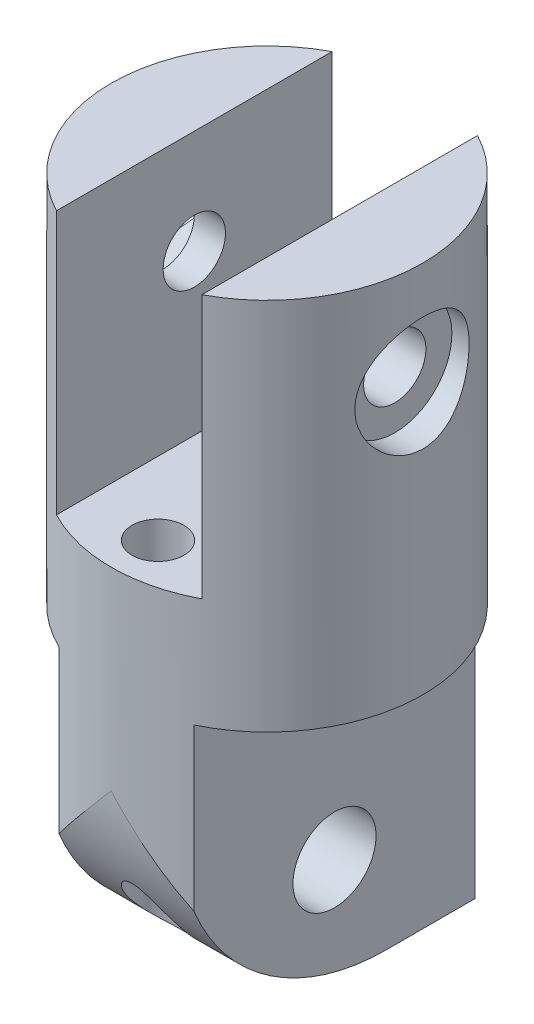
ISO-10303-21;
HEADER;
FILE_DESCRIPTION(('STEP AP214'),'2;1');
FILE_NAME('part.step','',(''),(''),'','','');
FILE_SCHEMA(('AUTOMOTIVE_DESIGN { 1 0 10303 214 1 1 1 1 }'));
ENDSEC;
DATA;
#1=APPLICATION_CONTEXT('core data for automotive mechanical design processes');
#2=APPLICATION_PROTOCOL_DEFINITION('international standard','automotive_design',2000,#1);
#3=PRODUCT_CONTEXT('',#1,'mechanical');
#4=PRODUCT('Part','Part','',(#3));
#5=PRODUCT_RELATED_PRODUCT_CATEGORY('part','',(#4));
#6=PRODUCT_DEFINITION_FORMATION('','',#4);
#7=PRODUCT_DEFINITION_CONTEXT('part definition',#1,'design');
#8=PRODUCT_DEFINITION('design','',#6,#7);
#9=PRODUCT_DEFINITION_SHAPE('','',#8);
#10=(LENGTH_UNIT() NAMED_UNIT(*) SI_UNIT(.MILLI.,.METRE.));
#11=(NAMED_UNIT(*) PLANE_ANGLE_UNIT() SI_UNIT($,.RADIAN.));
#12=(NAMED_UNIT(*) SI_UNIT($,.STERADIAN.) SOLID_ANGLE_UNIT());
#13=UNCERTAINTY_MEASURE_WITH_UNIT(LENGTH_MEASURE(1.E-05),#10,'distance_accuracy_value','');
#14=(GEOMETRIC_REPRESENTATION_CONTEXT(3) GLOBAL_UNCERTAINTY_ASSIGNED_CONTEXT((#13)) GLOBAL_UNIT_ASSIGNED_CONTEXT((#10,
#11,#12)) REPRESENTATION_CONTEXT('',''));
#15=CARTESIAN_POINT('',(0.,0.,0.));
#16=DIRECTION('',(0.,0.,1.));
#17=DIRECTION('',(1.,0.,0.));
#18=AXIS2_PLACEMENT_3D('',#15,#16,#17);
#19=CARTESIAN_POINT('',(3.25,7.,15.));
#20=DIRECTION('',(-1.,0.,0.));
#21=DIRECTION('',(0.,-1.,0.));
#22=AXIS2_PLACEMENT_3D('',#19,#20,#21);
#23=PLANE('',#22);
#24=CARTESIAN_POINT('',(3.25,-2.,7.5));
#25=DIRECTION('',(1.,0.,0.));
#26=DIRECTION('',(0.,1.,0.));
#27=AXIS2_PLACEMENT_3D('',#24,#25,#26);
#28=CIRCLE('',#27,2.);
#29=CARTESIAN_POINT('',(3.25,0.,7.5));
#30=VERTEX_POINT('',#29);
#31=EDGE_CURVE('E362',#30,#30,#28,.T.);
#32=ORIENTED_EDGE('',*,*,#31,.F.);
#33=EDGE_LOOP('',(#32));
#34=FACE_BOUND('',#33,.T.);
#35=DIRECTION('',(0.,1.,0.));
#36=VECTOR('',#35,1.);
#37=CARTESIAN_POINT('',(3.25,-7.,0.740747082702113));
#38=LINE('',#37,#36);
#39=CARTESIAN_POINT('',(3.25,-7.,0.740747082702113));
#40=VERTEX_POINT('',#39);
#41=CARTESIAN_POINT('',(3.25,7.,0.740747082702113));
#42=VERTEX_POINT('',#41);
#43=EDGE_CURVE('E241',#40,#42,#38,.T.);
#44=ORIENTED_EDGE('',*,*,#43,.T.);
#45=DIRECTION('',(0.,0.,-1.));
#46=VECTOR('',#45,1.);
#47=CARTESIAN_POINT('',(3.25,7.,15.));
#48=LINE('',#47,#46);
#49=CARTESIAN_POINT('',(3.25,7.,14.2592529172979));
#50=VERTEX_POINT('',#49);
#51=EDGE_CURVE('E380',#50,#42,#48,.T.);
#52=ORIENTED_EDGE('',*,*,#51,.F.);
#53=DIRECTION('',(0.,1.,0.));
#54=VECTOR('',#53,1.);
#55=CARTESIAN_POINT('',(3.25,-7.,14.2592529172979));
#56=LINE('',#55,#54);
#57=CARTESIAN_POINT('',(3.25,-0.777067038524808,14.2592529172979));
#58=VERTEX_POINT('',#57);
#59=EDGE_CURVE('E250',#58,#50,#56,.T.);
#60=ORIENTED_EDGE('',*,*,#59,.F.);
#61=CARTESIAN_POINT('',(3.25,3.,5.));
#62=DIRECTION('',(-1.,0.,0.));
#63=DIRECTION('',(0.,-1.,0.));
#64=AXIS2_PLACEMENT_3D('',#61,#62,#63);
#65=CIRCLE('',#64,10.);
#66=CARTESIAN_POINT('',(3.25,-7.,5.));
#67=VERTEX_POINT('',#66);
#68=EDGE_CURVE('E383',#58,#67,#65,.F.);
#69=ORIENTED_EDGE('',*,*,#68,.T.);
#70=DIRECTION('',(0.,0.,-1.));
#71=VECTOR('',#70,1.);
#72=CARTESIAN_POINT('',(3.25,-7.,15.));
#73=LINE('',#72,#71);
#74=EDGE_CURVE('E365',#67,#40,#73,.T.);
#75=ORIENTED_EDGE('',*,*,#74,.T.);
#76=EDGE_LOOP('',(#44,#52,#60,#69,#75));
#77=FACE_BOUND('',#76,.T.);
#78=ADVANCED_FACE('F69',(#34,#77),#23,.F.);
#79=CARTESIAN_POINT('',(-3.25,-7.,15.));
#80=DIRECTION('',(0.,1.,0.));
#81=DIRECTION('',(0.,0.,1.));
#82=AXIS2_PLACEMENT_3D('',#79,#80,#81);
#83=PLANE('',#82);
#84=CARTESIAN_POINT('',(0.,-7.,3.));
#85=DIRECTION('',(0.,-1.,0.));
#86=DIRECTION('',(0.,0.,-1.));
#87=AXIS2_PLACEMENT_3D('',#84,#85,#86);
#88=CIRCLE('',#87,1.25);
#89=CARTESIAN_POINT('',(0.,-7.,1.75));
#90=VERTEX_POINT('',#89);
#91=EDGE_CURVE('E650',#90,#90,#88,.T.);
#92=ORIENTED_EDGE('',*,*,#91,.F.);
#93=EDGE_LOOP('',(#92));
#94=FACE_BOUND('',#93,.T.);
#95=CARTESIAN_POINT('',(0.,-7.,7.5));
#96=DIRECTION('',(0.,1.,0.));
#97=DIRECTION('',(0.,0.,1.));
#98=AXIS2_PLACEMENT_3D('',#95,#96,#97);
#99=CIRCLE('',#98,7.5);
#100=CARTESIAN_POINT('',(-3.25,-7.,0.740747082702113));
#101=VERTEX_POINT('',#100);
#102=EDGE_CURVE('E251',#40,#101,#99,.T.);
#103=ORIENTED_EDGE('',*,*,#102,.F.);
#104=ORIENTED_EDGE('',*,*,#74,.F.);
#105=DIRECTION('',(1.,0.,0.));
#106=VECTOR('',#105,1.);
#107=CARTESIAN_POINT('',(-3.25,-7.,5.));
#108=LINE('',#107,#106);
#109=CARTESIAN_POINT('',(-3.25,-7.,5.));
#110=VERTEX_POINT('',#109);
#111=EDGE_CURVE('E385',#67,#110,#108,.F.);
#112=ORIENTED_EDGE('',*,*,#111,.T.);
#113=DIRECTION('',(0.,0.,-1.));
#114=VECTOR('',#113,1.);
#115=CARTESIAN_POINT('',(-3.25,-7.,15.));
#116=LINE('',#115,#114);
#117=EDGE_CURVE('E374',#110,#101,#116,.T.);
#118=ORIENTED_EDGE('',*,*,#117,.T.);
#119=EDGE_LOOP('',(#103,#104,#112,#118));
#120=FACE_BOUND('',#119,.T.);
#121=ADVANCED_FACE('F330',(#94,#120),#83,.F.);
#122=CARTESIAN_POINT('',(-3.25,7.,15.));
#123=DIRECTION('',(1.,0.,0.));
#124=DIRECTION('',(0.,1.,0.));
#125=AXIS2_PLACEMENT_3D('',#122,#123,#124);
#126=PLANE('',#125);
#127=CARTESIAN_POINT('',(-3.25,-2.,7.5));
#128=DIRECTION('',(1.,0.,0.));
#129=DIRECTION('',(0.,1.,0.));
#130=AXIS2_PLACEMENT_3D('',#127,#128,#129);
#131=CIRCLE('',#130,2.);
#132=CARTESIAN_POINT('',(-3.25,0.,7.5));
#133=VERTEX_POINT('',#132);
#134=EDGE_CURVE('E360',#133,#133,#131,.T.);
#135=ORIENTED_EDGE('',*,*,#134,.T.);
#136=EDGE_LOOP('',(#135));
#137=FACE_BOUND('',#136,.T.);
#138=CARTESIAN_POINT('',(-3.25,3.,5.));
#139=DIRECTION('',(1.,0.,0.));
#140=DIRECTION('',(0.,1.,0.));
#141=AXIS2_PLACEMENT_3D('',#138,#139,#140);
#142=CIRCLE('',#141,10.);
#143=CARTESIAN_POINT('',(-3.25,-0.777067038524727,14.2592529172979));
#144=VERTEX_POINT('',#143);
#145=EDGE_CURVE('E387',#110,#144,#142,.F.);
#146=ORIENTED_EDGE('',*,*,#145,.T.);
#147=DIRECTION('',(0.,1.,0.));
#148=VECTOR('',#147,1.);
#149=CARTESIAN_POINT('',(-3.25,-7.,14.2592529172979));
#150=LINE('',#149,#148);
#151=CARTESIAN_POINT('',(-3.25,7.,14.2592529172979));
#152=VERTEX_POINT('',#151);
#153=EDGE_CURVE('E239',#144,#152,#150,.T.);
#154=ORIENTED_EDGE('',*,*,#153,.T.);
#155=DIRECTION('',(0.,0.,-1.));
#156=VECTOR('',#155,1.);
#157=CARTESIAN_POINT('',(-3.25,7.,15.));
#158=LINE('',#157,#156);
#159=CARTESIAN_POINT('',(-3.25,7.,0.740747082702112));
#160=VERTEX_POINT('',#159);
#161=EDGE_CURVE('E377',#152,#160,#158,.T.);
#162=ORIENTED_EDGE('',*,*,#161,.T.);
#163=DIRECTION('',(0.,1.,0.));
#164=VECTOR('',#163,1.);
#165=CARTESIAN_POINT('',(-3.25,-7.,0.740747082702113));
#166=LINE('',#165,#164);
#167=EDGE_CURVE('E413',#101,#160,#166,.T.);
#168=ORIENTED_EDGE('',*,*,#167,.F.);
#169=ORIENTED_EDGE('',*,*,#117,.F.);
#170=EDGE_LOOP('',(#146,#154,#162,#168,#169));
#171=FACE_BOUND('',#170,.T.);
#172=ADVANCED_FACE('F335',(#137,#171),#126,.F.);
#173=CARTESIAN_POINT('',(0.,3.,5.));
#174=DIRECTION('',(-1.,0.,0.));
#175=DIRECTION('',(0.,0.,1.));
#176=AXIS2_PLACEMENT_3D('',#173,#174,#175);
#177=CYLINDRICAL_SURFACE('',#176,10.);
#178=CARTESIAN_POINT('',(0.,-4.60034588039679,11.4988262400479));
#179=CARTESIAN_POINT('',(0.0575288109608131,-4.60034633192946,11.4988256093035));
#180=CARTESIAN_POINT('',(0.11505399772144,-4.59693401826059,11.502822715136));
#181=CARTESIAN_POINT('',(0.22823665096081,-4.5834761227697,11.5185116248287));
#182=CARTESIAN_POINT('',(0.283893883210376,-4.57342971231711,11.5302043899131));
#183=CARTESIAN_POINT('',(0.391522903078539,-4.54727481070758,11.560414189299));
#184=CARTESIAN_POINT('',(0.443509328590721,-4.53119222670741,11.578902052222));
#185=CARTESIAN_POINT('',(0.542970946334787,-4.49367037095389,11.6216094500825));
#186=CARTESIAN_POINT('',(0.590444207603541,-4.47222882047104,11.6458314230352));
#187=CARTESIAN_POINT('',(0.693858382566063,-4.41754856445222,11.7068701017729));
#188=CARTESIAN_POINT('',(0.74800982895763,-4.38270365386441,11.7452795553846));
#189=CARTESIAN_POINT('',(0.847148183723735,-4.30681705487514,11.8274129335695));
#190=CARTESIAN_POINT('',(0.89211987702798,-4.26576527170702,11.8711454925512));
#191=CARTESIAN_POINT('',(0.987252420045894,-4.16367094789748,11.9777470851912));
#192=CARTESIAN_POINT('',(1.03375682534324,-4.10064843319519,12.0419724818224));
#193=CARTESIAN_POINT('',(1.11202550102491,-3.96841120618138,12.1728634669199));
#194=CARTESIAN_POINT('',(1.14376846925352,-3.89918771589937,12.2395324330415));
#195=CARTESIAN_POINT('',(1.20512691121574,-3.72575254744175,12.4015979723462));
#196=CARTESIAN_POINT('',(1.22801220853734,-3.61925054145639,12.4970726247963));
#197=CARTESIAN_POINT('',(1.25192625827192,-3.40072630611675,12.6845018482235));
#198=CARTESIAN_POINT('',(1.25290080853041,-3.28869107409675,12.7764471281507));
#199=CARTESIAN_POINT('',(1.2390160739484,-3.10025953801128,12.9243894094759));
#200=CARTESIAN_POINT('',(1.22941770428853,-3.02467078036612,12.9819973062648));
#201=CARTESIAN_POINT('',(1.20265869273446,-2.87271614168859,13.0944508219831));
#202=CARTESIAN_POINT('',(1.18549447992938,-2.79634991035228,13.1492951229198));
#203=CARTESIAN_POINT('',(1.14397630217485,-2.64352762751517,13.2558626611615));
#204=CARTESIAN_POINT('',(1.1196297934206,-2.56707175066068,13.3075890685247));
#205=CARTESIAN_POINT('',(1.0637867813495,-2.4146576671145,13.4077218470943));
#206=CARTESIAN_POINT('',(1.03229458006037,-2.33869918916016,13.4561301931831));
#207=CARTESIAN_POINT('',(0.959546911817907,-2.18327021358453,13.5523439188718));
#208=CARTESIAN_POINT('',(0.917797461428203,-2.10388405447856,13.5999146411363));
#209=CARTESIAN_POINT('',(0.824662482152894,-1.94813724713139,13.6904545809013));
#210=CARTESIAN_POINT('',(0.773285416874435,-1.87177401232619,13.7334277883316));
#211=CARTESIAN_POINT('',(0.676695759717014,-1.74841146843393,13.8009016608124));
#212=CARTESIAN_POINT('',(0.634678644034613,-1.69976793648386,13.8269441706631));
#213=CARTESIAN_POINT('',(0.543764619578198,-1.60733393640184,13.8755374312719));
#214=CARTESIAN_POINT('',(0.494882481116181,-1.56353340082824,13.8980954657454));
#215=CARTESIAN_POINT('',(0.410328609425263,-1.50057299344001,13.9300362657961));
#216=CARTESIAN_POINT('',(0.377364323238513,-1.47863442485303,13.9410472218018));
#217=CARTESIAN_POINT('',(0.308269866690451,-1.43908401630296,13.9607487164632));
#218=CARTESIAN_POINT('',(0.272144496533989,-1.42146576535685,13.9694426950006));
#219=CARTESIAN_POINT('',(0.204140015054733,-1.39500732552652,13.9824321515032));
#220=CARTESIAN_POINT('',(0.172770922493601,-1.38513258262856,13.9872509335304));
#221=CARTESIAN_POINT('',(0.10863906512088,-1.3702186469195,13.9945127413908));
#222=CARTESIAN_POINT('',(0.0758780804831299,-1.36517346082817,13.9969587118357));
#223=CARTESIAN_POINT('',(0.00971565662024547,-1.36049332526411,13.999228082882));
#224=CARTESIAN_POINT('',(-0.0236880276005255,-1.36088324321488,13.9990394291871));
#225=CARTESIAN_POINT('',(-0.0898697850396133,-1.36708221585887,13.9960326446625));
#226=CARTESIAN_POINT('',(-0.12264736944618,-1.37289534121178,13.9932125386644));
#227=CARTESIAN_POINT('',(-0.192498993484608,-1.39076317365085,13.9845039818664));
#228=CARTESIAN_POINT('',(-0.229268404492208,-1.40376175841571,13.9781502759771));
#229=CARTESIAN_POINT('',(-0.299995279155415,-1.43484740134685,13.9628359879126));
#230=CARTESIAN_POINT('',(-0.333946810007977,-1.45294485968761,13.9538700763329));
#231=CARTESIAN_POINT('',(-0.418925600500643,-1.50503533887645,13.9278178923304));
#232=CARTESIAN_POINT('',(-0.467632638347218,-1.54196424707584,13.909126433341));
#233=CARTESIAN_POINT('',(-0.558564300251688,-1.62136560507975,13.8682014347293));
#234=CARTESIAN_POINT('',(-0.600770050090257,-1.66385355695524,13.8459579501095));
#235=CARTESIAN_POINT('',(-0.678801636651221,-1.75107385940053,13.799413769684));
#236=CARTESIAN_POINT('',(-0.714760353406768,-1.79572378952148,13.7751782289425));
#237=CARTESIAN_POINT('',(-0.782368998157438,-1.88709197799037,13.724624021988));
#238=CARTESIAN_POINT('',(-0.814015009233281,-1.93381206615915,13.6983034959845));
#239=CARTESIAN_POINT('',(-0.873578262146656,-2.02867607236967,13.6438079702081));
#240=CARTESIAN_POINT('',(-0.901487844310031,-2.07682267540891,13.6156293325072));
#241=CARTESIAN_POINT('',(-0.953869165706419,-2.17399414365024,13.5576276254842));
#242=CARTESIAN_POINT('',(-0.978339944562463,-2.22301924990456,13.5278041000089));
#243=CARTESIAN_POINT('',(-1.03648457622005,-2.34837571239289,13.4500224067966));
#244=CARTESIAN_POINT('',(-1.06794492165718,-2.42508593896396,13.4010069487532));
#245=CARTESIAN_POINT('',(-1.12359720816828,-2.57896430130894,13.2996181391025));
#246=CARTESIAN_POINT('',(-1.14778503835172,-2.65613267101885,13.2472429085551));
#247=CARTESIAN_POINT('',(-1.18880186967856,-2.81020378415608,13.1394324196061));
#248=CARTESIAN_POINT('',(-1.2056368062501,-2.8871066919307,13.0839996701717));
#249=CARTESIAN_POINT('',(-1.23159320381571,-3.04008538662955,12.970348311449));
#250=CARTESIAN_POINT('',(-1.2407185329799,-3.11616156941276,12.912131114723));
#251=CARTESIAN_POINT('',(-1.25286792344638,-3.30085753472534,12.766499936122));
#252=CARTESIAN_POINT('',(-1.2513126972625,-3.40875200184953,12.6777134732531));
#253=CARTESIAN_POINT('',(-1.22772366104796,-3.61938148403095,12.4968619169247));
#254=CARTESIAN_POINT('',(-1.20573097558767,-3.72212642360836,12.4048037644697));
#255=CARTESIAN_POINT('',(-1.14743386723128,-3.8900628974733,12.2481774324844));
#256=CARTESIAN_POINT('',(-1.11731814138053,-3.95734634387134,12.1835632594184));
#257=CARTESIAN_POINT('',(-1.04332667285176,-4.0862124112587,12.0564668539613));
#258=CARTESIAN_POINT('',(-0.999468461074937,-4.14780216661484,11.9939820172111));
#259=CARTESIAN_POINT('',(-0.908823343821531,-4.24931724766382,11.8885005866831));
#260=CARTESIAN_POINT('',(-0.865205843162854,-4.2909138401453,11.8444000545688));
#261=CARTESIAN_POINT('',(-0.76883757221327,-4.36814251288804,11.7611894906291));
#262=CARTESIAN_POINT('',(-0.716098431613276,-4.40378207569116,11.7220732130628));
#263=CARTESIAN_POINT('',(-0.612245124736067,-4.46172352984542,11.657643266576));
#264=CARTESIAN_POINT('',(-0.562586109481275,-4.48527243298603,11.6311133106998));
#265=CARTESIAN_POINT('',(-0.458065299417217,-4.52641813587298,11.584375566612));
#266=CARTESIAN_POINT('',(-0.403206475147318,-4.54401830807232,11.5641641967587));
#267=CARTESIAN_POINT('',(-0.291201637526191,-4.57200141151039,11.5318637455773));
#268=CARTESIAN_POINT('',(-0.234168560095787,-4.58257937423715,11.5195555175503));
#269=CARTESIAN_POINT('',(-0.118088610350123,-4.59675024599106,11.5030383998551));
#270=CARTESIAN_POINT('',(-0.0590423964677331,-4.60034541698428,11.4988268873873));
#271=CARTESIAN_POINT('',(0.,-4.60034588039679,11.4988262400479));
#272=B_SPLINE_CURVE_WITH_KNOTS('',3,(#178,#179,#180,#181,#182,#183,#184,#185,#186,#187,#188,
#189,#190,#191,#192,#193,#194,#195,#196,#197,#198,#199,#200,#201,#202,#203,#204,#205,#206,#207,
#208,#209,#210,#211,#212,#213,#214,#215,#216,#217,#218,#219,#220,#221,#222,#223,#224,#225,#226,
#227,#228,#229,#230,#231,#232,#233,#234,#235,#236,#237,#238,#239,#240,#241,#242,#243,#244,#245,
#246,#247,#248,#249,#250,#251,#252,#253,#254,#255,#256,#257,#258,#259,#260,#261,#262,#263,#264,
#265,#266,#267,#268,#269,#270,#271),.UNSPECIFIED.,.T.,.F.,(4,2,2,2,2,2,2,2,2,2,2,2,2,2,2,2,2,2,
2,2,2,2,2,2,2,2,2,2,2,2,2,2,2,2,2,2,2,2,2,2,2,2,2,2,2,2,4),(0.,0.172348273756097,
0.344718078712481,0.516356381687259,0.688067792913604,0.911779782670741,1.13585960792365,
1.43805653794473,1.74068822377861,2.17289589147549,2.60617262432262,2.89241887086686,
3.17880036422053,3.46488559482381,3.75079904413221,4.05491767460736,4.35877019896172,
4.56645367834022,4.77369697735467,4.89669523302743,5.0195098500147,5.11882624455042,
5.21801923115933,5.31766620732977,5.41738803875374,5.53527045520422,5.65339507916606,
5.84407282185146,6.03529410095019,6.22174555510802,6.40836523689131,6.59536181455266,
6.78241051261683,7.07097917352888,7.35971064655029,7.64820861604563,7.93656175026965,
8.35438832069885,8.77137595038052,9.06454630970578,9.35734419210841,9.58060303576063,
9.80357930464446,9.98592361306855,10.1681643728299,10.3451044636672,10.5219872279666),.UNSPECIFIED.);
#273=CARTESIAN_POINT('',(0.,-4.60034588039679,11.4988262400479));
#274=VERTEX_POINT('',#273);
#275=EDGE_CURVE('E206',#274,#274,#272,.T.);
#276=ORIENTED_EDGE('',*,*,#275,.F.);
#277=EDGE_LOOP('',(#276));
#278=FACE_BOUND('',#277,.T.);
#279=CARTESIAN_POINT('',(-3.25,-0.777067038524808,14.2592529172979));
#280=CARTESIAN_POINT('',(-3.11964803441231,-0.623422022657622,14.3219224333858));
#281=CARTESIAN_POINT('',(-2.98826751006328,-0.469006401054278,14.3804577255213));
#282=CARTESIAN_POINT('',(-2.7237404145902,-0.158847919875885,14.4894004376096));
#283=CARTESIAN_POINT('',(-2.59059398915032,-0.00310517016124126,14.539808523586));
#284=CARTESIAN_POINT('',(-2.1888915842863,0.46585242207751,14.6790735815163));
#285=CARTESIAN_POINT('',(-1.91809052694975,0.78077536711749,14.7559627524007));
#286=CARTESIAN_POINT('',(-1.37572389886744,1.4099863558356,14.8779292423823));
#287=CARTESIAN_POINT('',(-1.10419730090432,1.72424533420997,14.9233371711216));
#288=CARTESIAN_POINT('',(-0.5594483269617,2.35399928323636,14.984120133363));
#289=CARTESIAN_POINT('',(-0.286226977240884,2.66949346995055,14.9995118431247));
#290=CARTESIAN_POINT('',(-0.00872869143398145,2.9899209752028,14.9999961890182));
#291=CARTESIAN_POINT('',(-0.00436433249316354,2.9949605028181,14.9999999984407));
#292=CARTESIAN_POINT('',(0.,3.,15.));
#293=B_SPLINE_CURVE_WITH_KNOTS('',3,(#279,#280,#281,#282,#283,#284,#285,#286,#287,#288,#289,
#290,#291,#292),.UNSPECIFIED.,.F.,.F.,(4,2,2,2,2,2,4),(0.,0.632933239584302,1.26581458397719,
2.53166454368447,3.78401078214235,5.03566104994836,5.05566105321367),.UNSPECIFIED.);
#294=CARTESIAN_POINT('',(0.,3.,15.));
#295=VERTEX_POINT('',#294);
#296=EDGE_CURVE('E243',#144,#295,#293,.T.);
#297=ORIENTED_EDGE('',*,*,#296,.F.);
#298=ORIENTED_EDGE('',*,*,#145,.F.);
#299=ORIENTED_EDGE('',*,*,#111,.F.);
#300=ORIENTED_EDGE('',*,*,#68,.F.);
#301=CARTESIAN_POINT('',(3.25,-0.777067038524808,14.2592529172979));
#302=CARTESIAN_POINT('',(3.11964803441233,-0.623422022657608,14.3219224333858));
#303=CARTESIAN_POINT('',(2.9882675100633,-0.469006401054276,14.3804577255213));
#304=CARTESIAN_POINT('',(2.7237404145902,-0.158847919875907,14.4894004376096));
#305=CARTESIAN_POINT('',(2.59059398915031,-0.00310517016127368,14.539808523586));
#306=CARTESIAN_POINT('',(2.18889158428635,0.465852422077542,14.6790735815163));
#307=CARTESIAN_POINT('',(1.91809052694998,0.780775367117685,14.7559627524007));
#308=CARTESIAN_POINT('',(1.37572389886721,1.40998635583541,14.8779292423823));
#309=CARTESIAN_POINT('',(1.10419730090346,1.72424533420923,14.9233371711216));
#310=CARTESIAN_POINT('',(0.559448326962563,2.35399928323711,14.984120133363));
#311=CARTESIAN_POINT('',(0.286226977244101,2.66949346995334,14.9995118431247));
#312=CARTESIAN_POINT('',(0.00872869143408389,2.98992097520289,14.9999961890182));
#313=CARTESIAN_POINT('',(0.00436433249321547,2.99496050281815,14.9999999984407));
#314=CARTESIAN_POINT('',(0.,3.,15.));
#315=B_SPLINE_CURVE_WITH_KNOTS('',3,(#301,#302,#303,#304,#305,#306,#307,#308,#309,#310,#311,
#312,#313,#314),.UNSPECIFIED.,.F.,.F.,(4,2,2,2,2,2,4),(0.,0.632933239584291,1.26581458397717,
2.53166454368448,3.78401078214236,5.03566104994837,5.05566105321368),.UNSPECIFIED.);
#316=EDGE_CURVE('E263',#58,#295,#315,.T.);
#317=ORIENTED_EDGE('',*,*,#316,.T.);
#318=EDGE_LOOP('',(#297,#298,#299,#300,#317));
#319=FACE_BOUND('',#318,.T.);
#320=ADVANCED_FACE('F71',(#278,#319),#177,.T.);
#321=CARTESIAN_POINT('',(0.,25.,7.5));
#322=DIRECTION('',(0.,1.,0.));
#323=DIRECTION('',(0.,0.,1.));
#324=AXIS2_PLACEMENT_3D('',#321,#322,#323);
#325=PLANE('',#324);
#326=DIRECTION('',(0.,0.,1.));
#327=VECTOR('',#326,1.);
#328=CARTESIAN_POINT('',(-3.5,25.,7.5));
#329=LINE('',#328,#327);
#330=CARTESIAN_POINT('',(-3.5,25.,0.866750419289202));
#331=VERTEX_POINT('',#330);
#332=CARTESIAN_POINT('',(-3.5,25.,14.1332495807108));
#333=VERTEX_POINT('',#332);
#334=EDGE_CURVE('E391',#331,#333,#329,.T.);
#335=ORIENTED_EDGE('',*,*,#334,.F.);
#336=CARTESIAN_POINT('',(0.,25.,7.5));
#337=DIRECTION('',(0.,1.,0.));
#338=DIRECTION('',(0.,0.,1.));
#339=AXIS2_PLACEMENT_3D('',#336,#337,#338);
#340=CIRCLE('',#339,7.5);
#341=EDGE_CURVE('E368',#331,#333,#340,.T.);
#342=ORIENTED_EDGE('',*,*,#341,.T.);
#343=EDGE_LOOP('',(#335,#342));
#344=FACE_BOUND('',#343,.T.);
#345=ADVANCED_FACE('F346',(#344),#325,.T.);
#346=CARTESIAN_POINT('',(-3.25,-2.,7.5));
#347=DIRECTION('',(1.,0.,0.));
#348=DIRECTION('',(0.,1.,0.));
#349=AXIS2_PLACEMENT_3D('',#346,#347,#348);
#350=CYLINDRICAL_SURFACE('',#349,2.);
#351=ORIENTED_EDGE('',*,*,#134,.F.);
#352=EDGE_LOOP('',(#351));
#353=FACE_BOUND('',#352,.T.);
#354=ORIENTED_EDGE('',*,*,#31,.T.);
#355=EDGE_LOOP('',(#354));
#356=FACE_BOUND('',#355,.T.);
#357=ADVANCED_FACE('F343',(#353,#356),#350,.F.);
#358=CARTESIAN_POINT('',(0.,7.,7.5));
#359=DIRECTION('',(0.,1.,0.));
#360=DIRECTION('',(0.,0.,1.));
#361=AXIS2_PLACEMENT_3D('',#358,#359,#360);
#362=PLANE('',#361);
#363=CARTESIAN_POINT('',(0.,7.,7.5));
#364=DIRECTION('',(0.,1.,0.));
#365=DIRECTION('',(0.,0.,1.));
#366=AXIS2_PLACEMENT_3D('',#363,#364,#365);
#367=CIRCLE('',#366,7.5);
#368=EDGE_CURVE('E423',#50,#42,#367,.T.);
#369=ORIENTED_EDGE('',*,*,#368,.F.);
#370=ORIENTED_EDGE('',*,*,#51,.T.);
#371=EDGE_LOOP('',(#369,#370));
#372=FACE_BOUND('',#371,.T.);
#373=ADVANCED_FACE('F345',(#372),#362,.F.);
#374=CARTESIAN_POINT('',(0.,25.,7.5));
#375=DIRECTION('',(0.,-1.,0.));
#376=DIRECTION('',(0.,0.,-1.));
#377=AXIS2_PLACEMENT_3D('',#374,#375,#376);
#378=CYLINDRICAL_SURFACE('',#377,7.5);
#379=DIRECTION('',(0.,-1.,0.));
#380=VECTOR('',#379,1.);
#381=CARTESIAN_POINT('',(-6.75925291729789,25.,4.25000000000001));
#382=LINE('',#381,#380);
#383=CARTESIAN_POINT('',(-6.7592529172979,18.1236116251337,4.25));
#384=VERTEX_POINT('',#383);
#385=CARTESIAN_POINT('',(-6.75925291729789,21.8763883748663,4.25));
#386=VERTEX_POINT('',#385);
#387=EDGE_CURVE('E79',#384,#386,#382,.F.);
#388=ORIENTED_EDGE('',*,*,#387,.T.);
#389=CARTESIAN_POINT('',(0.,23.7527767497326,7.5));
#390=DIRECTION('',(0.,0.86602540378444,-0.499999999999998));
#391=DIRECTION('',(0.,-0.499999999999998,-0.86602540378444));
#392=AXIS2_PLACEMENT_3D('',#389,#390,#391);
#393=ELLIPSE('',#392,8.66025403784438,7.5);
#394=CARTESIAN_POINT('',(-7.5,23.7527767497326,7.5));
#395=VERTEX_POINT('',#394);
#396=EDGE_CURVE('E12',#386,#395,#393,.T.);
#397=ORIENTED_EDGE('',*,*,#396,.T.);
#398=CARTESIAN_POINT('',(0.,23.7527767497326,7.5));
#399=DIRECTION('',(0.,0.866025403784439,0.5));
#400=DIRECTION('',(0.,-0.5,0.866025403784439));
#401=AXIS2_PLACEMENT_3D('',#398,#399,#400);
#402=ELLIPSE('',#401,8.66025403784439,7.5);
#403=CARTESIAN_POINT('',(-6.75925291729789,21.8763883748663,10.75));
#404=VERTEX_POINT('',#403);
#405=EDGE_CURVE('E186',#395,#404,#402,.T.);
#406=ORIENTED_EDGE('',*,*,#405,.T.);
#407=DIRECTION('',(0.,-1.,0.));
#408=VECTOR('',#407,1.);
#409=CARTESIAN_POINT('',(-6.75925291729789,25.,10.75));
#410=LINE('',#409,#408);
#411=CARTESIAN_POINT('',(-6.75925291729789,18.1236116251337,10.75));
#412=VERTEX_POINT('',#411);
#413=EDGE_CURVE('E659',#404,#412,#410,.T.);
#414=ORIENTED_EDGE('',*,*,#413,.T.);
#415=CARTESIAN_POINT('',(0.,16.2472232502674,7.5));
#416=DIRECTION('',(0.,-0.866025403784439,0.499999999999999));
#417=DIRECTION('',(0.,-0.499999999999999,-0.866025403784439));
#418=AXIS2_PLACEMENT_3D('',#415,#416,#417);
#419=ELLIPSE('',#418,8.66025403784438,7.5);
#420=CARTESIAN_POINT('',(-7.5,16.2472232502674,7.5));
#421=VERTEX_POINT('',#420);
#422=EDGE_CURVE('E645',#412,#421,#419,.T.);
#423=ORIENTED_EDGE('',*,*,#422,.T.);
#424=CARTESIAN_POINT('',(0.,16.2472232502674,7.5));
#425=DIRECTION('',(0.,-0.866025403784439,-0.5));
#426=DIRECTION('',(0.,-0.5,0.866025403784439));
#427=AXIS2_PLACEMENT_3D('',#424,#425,#426);
#428=ELLIPSE('',#427,8.66025403784439,7.5);
#429=EDGE_CURVE('E642',#421,#384,#428,.T.);
#430=ORIENTED_EDGE('',*,*,#429,.T.);
#431=EDGE_LOOP('',(#388,#397,#406,#414,#423,#430));
#432=FACE_BOUND('',#431,.T.);
#433=CARTESIAN_POINT('',(7.5,17.25,7.5));
#434=CARTESIAN_POINT('',(7.50000312186943,17.2499957601559,7.64916340091462));
#435=CARTESIAN_POINT('',(7.49551083407196,17.2621745142851,7.79829715261848));
#436=CARTESIAN_POINT('',(7.47803771691331,17.3103807639427,8.09212061063863));
#437=CARTESIAN_POINT('',(7.46505769251259,17.3464059979212,8.23681073701748));
#438=CARTESIAN_POINT('',(7.43200599882739,17.4408685459559,8.51746784637522));
#439=CARTESIAN_POINT('',(7.41194764249896,17.4992638038986,8.65345064275875));
#440=CARTESIAN_POINT('',(7.36674725461798,17.6365998026205,8.91368339201445));
#441=CARTESIAN_POINT('',(7.34160392586796,17.7155457874537,9.03793033913379));
#442=CARTESIAN_POINT('',(7.28769120419502,17.8951165871431,9.2762429222357));
#443=CARTESIAN_POINT('',(7.25882233991119,17.9964330069993,9.38976472910907));
#444=CARTESIAN_POINT('',(7.20121334184221,18.2164002540435,9.59863947514447));
#445=CARTESIAN_POINT('',(7.17247324728629,18.335056036644,9.69398720232952));
#446=CARTESIAN_POINT('',(7.11723192199314,18.5915596285549,9.86719005872891));
#447=CARTESIAN_POINT('',(7.09084889561059,18.7299454567554,9.94428985961203));
#448=CARTESIAN_POINT('',(7.04484932142569,19.0188406266334,10.0738807153727));
#449=CARTESIAN_POINT('',(7.02523020673632,19.1693453424172,10.126381108384));
#450=CARTESIAN_POINT('',(6.99603990329749,19.4719588814006,10.2031578776842));
#451=CARTESIAN_POINT('',(6.98610194555094,19.6237687440343,10.2284685676662));
#452=CARTESIAN_POINT('',(6.97632326042149,19.929781189296,10.2533816996786));
#453=CARTESIAN_POINT('',(6.97647859485257,20.0839828152304,10.2529941686023));
#454=CARTESIAN_POINT('',(6.98655161563675,20.3810789225906,10.2273152463416));
#455=CARTESIAN_POINT('',(6.99591416236741,20.5241180714193,10.2034399938661));
#456=CARTESIAN_POINT('',(7.02242705549906,20.8039973045031,10.1337980138));
#457=CARTESIAN_POINT('',(7.03957852258203,20.9408364935813,10.088028135926));
#458=CARTESIAN_POINT('',(7.08008337610026,21.2073857915592,9.97508832183277));
#459=CARTESIAN_POINT('',(7.10354498086313,21.3369185940038,9.90754043957437));
#460=CARTESIAN_POINT('',(7.15398860670264,21.5832293506763,9.75322516181072));
#461=CARTESIAN_POINT('',(7.18097180350953,21.7000030210703,9.66645134069005));
#462=CARTESIAN_POINT('',(7.23752687525343,21.9253454837079,9.46960155284458));
#463=CARTESIAN_POINT('',(7.26715387777086,22.032910199767,9.35838932735392));
#464=CARTESIAN_POINT('',(7.32416772152515,22.2281537541427,9.11915779399269));
#465=CARTESIAN_POINT('',(7.3515542477326,22.3158297990106,8.99113612914646));
#466=CARTESIAN_POINT('',(7.40150404263882,22.469849921192,8.71944943250202));
#467=CARTESIAN_POINT('',(7.42399328235867,22.5358733353786,8.57558804380358));
#468=CARTESIAN_POINT('',(7.46106828194135,22.6424524315738,8.27777168193606));
#469=CARTESIAN_POINT('',(7.47565739110895,22.6830189073552,8.12382101725383));
#470=CARTESIAN_POINT('',(7.49470661210037,22.7356341007007,7.81865715690413));
#471=CARTESIAN_POINT('',(7.49964681722227,22.7490358318725,7.66770697278252));
#472=CARTESIAN_POINT('',(7.50031608885126,22.7508630018728,7.36565203255629));
#473=CARTESIAN_POINT('',(7.49604709187873,22.7392936916369,7.21454731562548));
#474=CARTESIAN_POINT('',(7.47909471176213,22.6925452079771,6.92222898460096));
#475=CARTESIAN_POINT('',(7.46672323625137,22.6582406720003,6.78085553796851));
#476=CARTESIAN_POINT('',(7.43512235809386,22.5681349472647,6.50596090832168));
#477=CARTESIAN_POINT('',(7.41589206317618,22.5123309615443,6.37244074958353));
#478=CARTESIAN_POINT('',(7.3717934654489,22.3790539116285,6.11272893005816));
#479=CARTESIAN_POINT('',(7.34677844528394,22.301001869951,5.98686004951381));
#480=CARTESIAN_POINT('',(7.29389308718916,22.1261036082178,5.74959324541106));
#481=CARTESIAN_POINT('',(7.26602173076095,22.0292506731475,5.63820051602461));
#482=CARTESIAN_POINT('',(7.20858443222809,21.813177374235,5.42659777286201));
#483=CARTESIAN_POINT('',(7.17901017230758,21.6930149402375,5.32734951094925));
#484=CARTESIAN_POINT('',(7.12301420495134,21.4371450050785,5.15025082554627));
#485=CARTESIAN_POINT('',(7.09659271654603,21.3014364251721,5.0724018882281));
#486=CARTESIAN_POINT('',(7.05004267507774,21.0174626284658,4.94034362890839));
#487=CARTESIAN_POINT('',(7.02993081583834,20.8691653988561,4.88619687043256));
#488=CARTESIAN_POINT('',(6.99881623412452,20.564621151899,4.80397675168701));
#489=CARTESIAN_POINT('',(6.98780821140261,20.4083788165147,4.77588821917411));
#490=CARTESIAN_POINT('',(6.97683139543634,20.1027486399612,4.74790483037546));
#491=CARTESIAN_POINT('',(6.97622414135253,19.9535317080346,4.74637927832575));
#492=CARTESIAN_POINT('',(6.98449276936025,19.6570884497829,4.76742136880885));
#493=CARTESIAN_POINT('',(6.99336783146823,19.5098619524497,4.789986928062));
#494=CARTESIAN_POINT('',(7.01908063198066,19.225730914034,4.85732302895733));
#495=CARTESIAN_POINT('',(7.03568945153918,19.0886530299248,4.90145689764079));
#496=CARTESIAN_POINT('',(7.0748745278557,18.8237608470382,5.01012643456598));
#497=CARTESIAN_POINT('',(7.09745226019147,18.695948848854,5.07466714836784));
#498=CARTESIAN_POINT('',(7.14745651289183,18.446173516875,5.22612146257841));
#499=CARTESIAN_POINT('',(7.17507087475862,18.3248355716804,5.31400373788159));
#500=CARTESIAN_POINT('',(7.23136315938062,18.0981067555171,5.50811900047636));
#501=CARTESIAN_POINT('',(7.26004141030265,17.9927208569003,5.61435768756782));
#502=CARTESIAN_POINT('',(7.31698041886032,17.7954400202964,5.84862840053256));
#503=CARTESIAN_POINT('',(7.34514593066589,17.7045025963147,5.97749345971985));
#504=CARTESIAN_POINT('',(7.39633669940812,17.5456226545033,6.24965784854994));
#505=CARTESIAN_POINT('',(7.41936193536523,17.4776802305249,6.39295723710164));
#506=CARTESIAN_POINT('',(7.45811714803401,17.3658300233738,6.69376598407588));
#507=CARTESIAN_POINT('',(7.4736521370045,17.3225597743705,6.85153953395494));
#508=CARTESIAN_POINT('',(7.49458959004745,17.2646534781244,7.17288901781912));
#509=CARTESIAN_POINT('',(7.4999965772887,17.2500046484207,7.336462328356));
#510=CARTESIAN_POINT('',(7.5,17.25,7.5));
#511=B_SPLINE_CURVE_WITH_KNOTS('',3,(#433,#434,#435,#436,#437,#438,#439,#440,#441,#442,#443,
#444,#445,#446,#447,#448,#449,#450,#451,#452,#453,#454,#455,#456,#457,#458,#459,#460,#461,#462,
#463,#464,#465,#466,#467,#468,#469,#470,#471,#472,#473,#474,#475,#476,#477,#478,#479,#480,#481,
#482,#483,#484,#485,#486,#487,#488,#489,#490,#491,#492,#493,#494,#495,#496,#497,#498,#499,#500,
#501,#502,#503,#504,#505,#506,#507,#508,#509,#510),.UNSPECIFIED.,.T.,.F.,(4,2,2,2,2,2,2,2,2,2,2,
2,2,2,2,2,2,2,2,2,2,2,2,2,2,2,2,2,2,2,2,2,2,2,2,2,2,2,4),(0.,0.446887269349349,0.89373216292337,
1.33974106914939,1.7858638979375,2.24842473965862,2.71111803601497,3.1905067289315,
3.66971329430219,4.12996375453753,4.5900346359978,5.0239670519462,5.45796192255757,
5.89993527296308,6.34205656133036,6.81248619551746,7.28298186270095,7.76015995462979,
8.23713558552158,8.68970480563611,9.14217886831115,9.57818454876606,10.0142469703521,
10.4628962097749,10.9117059866708,11.385386450699,11.8590998032843,12.3340561236824,
12.80873572978,13.254164536792,13.6995548284527,14.13252653843,14.5656053837986,15.020648736522,
15.4758336382825,15.9541458857871,16.4324600854427,16.9226310274791,17.4125830067758),.UNSPECIFIED.);
#512=CARTESIAN_POINT('',(7.5,17.25,7.5));
#513=VERTEX_POINT('',#512);
#514=EDGE_CURVE('E275',#513,#513,#511,.T.);
#515=ORIENTED_EDGE('',*,*,#514,.T.);
#516=EDGE_LOOP('',(#515));
#517=FACE_BOUND('',#516,.T.);
#518=DIRECTION('',(0.,-1.,0.));
#519=VECTOR('',#518,1.);
#520=CARTESIAN_POINT('',(3.5,25.,14.1332495807108));
#521=LINE('',#520,#519);
#522=CARTESIAN_POINT('',(3.5,25.,14.1332495807108));
#523=VERTEX_POINT('',#522);
#524=CARTESIAN_POINT('',(3.5,12.32,14.1332495807108));
#525=VERTEX_POINT('',#524);
#526=EDGE_CURVE('E95',#523,#525,#521,.T.);
#527=ORIENTED_EDGE('',*,*,#526,.T.);
#528=CARTESIAN_POINT('',(0.,12.32,7.5));
#529=DIRECTION('',(0.,-1.,0.));
#530=DIRECTION('',(0.,0.,-1.));
#531=AXIS2_PLACEMENT_3D('',#528,#529,#530);
#532=CIRCLE('',#531,7.5);
#533=CARTESIAN_POINT('',(-3.50000000000001,12.32,14.1332495807108));
#534=VERTEX_POINT('',#533);
#535=EDGE_CURVE('E270',#525,#534,#532,.T.);
#536=ORIENTED_EDGE('',*,*,#535,.T.);
#537=DIRECTION('',(0.,-1.,0.));
#538=VECTOR('',#537,1.);
#539=CARTESIAN_POINT('',(-3.5,25.,14.1332495807108));
#540=LINE('',#539,#538);
#541=EDGE_CURVE('E402',#534,#333,#540,.F.);
#542=ORIENTED_EDGE('',*,*,#541,.T.);
#543=ORIENTED_EDGE('',*,*,#341,.F.);
#544=DIRECTION('',(0.,-1.,0.));
#545=VECTOR('',#544,1.);
#546=CARTESIAN_POINT('',(-3.5,25.,0.866750419289202));
#547=LINE('',#546,#545);
#548=CARTESIAN_POINT('',(-3.50000000000001,12.32,0.866750419289203));
#549=VERTEX_POINT('',#548);
#550=EDGE_CURVE('E421',#331,#549,#547,.T.);
#551=ORIENTED_EDGE('',*,*,#550,.T.);
#552=CARTESIAN_POINT('',(3.5,12.32,0.866750419289202));
#553=VERTEX_POINT('',#552);
#554=EDGE_CURVE('E271',#549,#553,#532,.T.);
#555=ORIENTED_EDGE('',*,*,#554,.T.);
#556=DIRECTION('',(0.,-1.,0.));
#557=VECTOR('',#556,1.);
#558=CARTESIAN_POINT('',(3.5,25.,0.866750419289202));
#559=LINE('',#558,#557);
#560=CARTESIAN_POINT('',(3.5,25.,0.866750419289202));
#561=VERTEX_POINT('',#560);
#562=EDGE_CURVE('E412',#553,#561,#559,.F.);
#563=ORIENTED_EDGE('',*,*,#562,.T.);
#564=EDGE_CURVE('E363',#523,#561,#340,.T.);
#565=ORIENTED_EDGE('',*,*,#564,.F.);
#566=EDGE_LOOP('',(#527,#536,#542,#543,#551,#555,#563,#565));
#567=FACE_BOUND('',#566,.T.);
#568=EDGE_CURVE('E422',#160,#152,#367,.T.);
#569=ORIENTED_EDGE('',*,*,#568,.T.);
#570=ORIENTED_EDGE('',*,*,#153,.F.);
#571=ORIENTED_EDGE('',*,*,#296,.T.);
#572=ORIENTED_EDGE('',*,*,#316,.F.);
#573=ORIENTED_EDGE('',*,*,#59,.T.);
#574=ORIENTED_EDGE('',*,*,#368,.T.);
#575=ORIENTED_EDGE('',*,*,#43,.F.);
#576=ORIENTED_EDGE('',*,*,#102,.T.);
#577=ORIENTED_EDGE('',*,*,#167,.T.);
#578=EDGE_LOOP('',(#569,#570,#571,#572,#573,#574,#575,#576,#577));
#579=FACE_BOUND('',#578,.T.);
#580=ADVANCED_FACE('F284',(#432,#517,#567,#579),#378,.T.);
#581=DIRECTION('',(0.,0.,-1.));
#582=VECTOR('',#581,1.);
#583=CARTESIAN_POINT('',(3.5,25.,7.5));
#584=LINE('',#583,#582);
#585=EDGE_CURVE('E390',#523,#561,#584,.T.);
#586=ORIENTED_EDGE('',*,*,#585,.F.);
#587=ORIENTED_EDGE('',*,*,#564,.T.);
#588=EDGE_LOOP('',(#586,#587));
#589=FACE_BOUND('',#588,.T.);
#590=ADVANCED_FACE('F356',(#589),#325,.T.);
#591=ORIENTED_EDGE('',*,*,#161,.F.);
#592=ORIENTED_EDGE('',*,*,#568,.F.);
#593=EDGE_LOOP('',(#591,#592));
#594=FACE_BOUND('',#593,.T.);
#595=ADVANCED_FACE('F353',(#594),#362,.F.);
#596=CARTESIAN_POINT('',(-3.50000000000001,12.32,15.));
#597=DIRECTION('',(0.,-1.,0.));
#598=DIRECTION('',(0.,0.,-1.));
#599=AXIS2_PLACEMENT_3D('',#596,#597,#598);
#600=PLANE('',#599);
#601=CARTESIAN_POINT('',(0.,12.32,12.7488262400479));
#602=DIRECTION('',(0.,-1.,0.));
#603=DIRECTION('',(0.,0.,-1.));
#604=AXIS2_PLACEMENT_3D('',#601,#602,#603);
#605=CIRCLE('',#604,1.25);
#606=CARTESIAN_POINT('',(0.,12.32,11.4988262400479));
#607=VERTEX_POINT('',#606);
#608=EDGE_CURVE('E74',#607,#607,#605,.T.);
#609=ORIENTED_EDGE('',*,*,#608,.T.);
#610=EDGE_LOOP('',(#609));
#611=FACE_BOUND('',#610,.T.);
#612=CARTESIAN_POINT('',(0.,12.32,3.));
#613=DIRECTION('',(0.,-1.,0.));
#614=DIRECTION('',(0.,0.,-1.));
#615=AXIS2_PLACEMENT_3D('',#612,#613,#614);
#616=CIRCLE('',#615,1.25);
#617=CARTESIAN_POINT('',(0.,12.32,1.75));
#618=VERTEX_POINT('',#617);
#619=EDGE_CURVE('E648',#618,#618,#616,.T.);
#620=ORIENTED_EDGE('',*,*,#619,.T.);
#621=EDGE_LOOP('',(#620));
#622=FACE_BOUND('',#621,.T.);
#623=DIRECTION('',(0.,0.,-1.));
#624=VECTOR('',#623,1.);
#625=CARTESIAN_POINT('',(3.5,12.32,15.));
#626=LINE('',#625,#624);
#627=EDGE_CURVE('E408',#525,#553,#626,.T.);
#628=ORIENTED_EDGE('',*,*,#627,.T.);
#629=ORIENTED_EDGE('',*,*,#554,.F.);
#630=DIRECTION('',(0.,0.,-1.));
#631=VECTOR('',#630,1.);
#632=CARTESIAN_POINT('',(-3.50000000000001,12.32,15.));
#633=LINE('',#632,#631);
#634=EDGE_CURVE('E410',#534,#549,#633,.T.);
#635=ORIENTED_EDGE('',*,*,#634,.F.);
#636=ORIENTED_EDGE('',*,*,#535,.F.);
#637=EDGE_LOOP('',(#628,#629,#635,#636));
#638=FACE_BOUND('',#637,.T.);
#639=ADVANCED_FACE('F260',(#611,#622,#638),#600,.F.);
#640=CARTESIAN_POINT('',(-3.5,25.,15.));
#641=DIRECTION('',(-1.,0.,0.));
#642=DIRECTION('',(0.,-1.,0.));
#643=AXIS2_PLACEMENT_3D('',#640,#641,#642);
#644=PLANE('',#643);
#645=CARTESIAN_POINT('',(-3.5,20.,7.5));
#646=DIRECTION('',(-1.,0.,0.));
#647=DIRECTION('',(0.,-1.,0.));
#648=AXIS2_PLACEMENT_3D('',#645,#646,#647);
#649=CIRCLE('',#648,1.5);
#650=CARTESIAN_POINT('',(-3.5,18.5,7.5));
#651=VERTEX_POINT('',#650);
#652=EDGE_CURVE('E236',#651,#651,#649,.T.);
#653=ORIENTED_EDGE('',*,*,#652,.T.);
#654=EDGE_LOOP('',(#653));
#655=FACE_BOUND('',#654,.T.);
#656=ORIENTED_EDGE('',*,*,#334,.T.);
#657=ORIENTED_EDGE('',*,*,#541,.F.);
#658=ORIENTED_EDGE('',*,*,#634,.T.);
#659=ORIENTED_EDGE('',*,*,#550,.F.);
#660=EDGE_LOOP('',(#656,#657,#658,#659));
#661=FACE_BOUND('',#660,.T.);
#662=ADVANCED_FACE('F448',(#655,#661),#644,.F.);
#663=CARTESIAN_POINT('',(3.5,25.,15.));
#664=DIRECTION('',(1.,0.,0.));
#665=DIRECTION('',(0.,1.,0.));
#666=AXIS2_PLACEMENT_3D('',#663,#664,#665);
#667=PLANE('',#666);
#668=CARTESIAN_POINT('',(3.5,20.,7.5));
#669=DIRECTION('',(1.,0.,0.));
#670=DIRECTION('',(0.,1.,0.));
#671=AXIS2_PLACEMENT_3D('',#668,#669,#670);
#672=CIRCLE('',#671,1.5);
#673=CARTESIAN_POINT('',(3.5,21.5,7.5));
#674=VERTEX_POINT('',#673);
#675=EDGE_CURVE('E240',#674,#674,#672,.T.);
#676=ORIENTED_EDGE('',*,*,#675,.T.);
#677=EDGE_LOOP('',(#676));
#678=FACE_BOUND('',#677,.T.);
#679=ORIENTED_EDGE('',*,*,#585,.T.);
#680=ORIENTED_EDGE('',*,*,#562,.F.);
#681=ORIENTED_EDGE('',*,*,#627,.F.);
#682=ORIENTED_EDGE('',*,*,#526,.F.);
#683=EDGE_LOOP('',(#679,#680,#681,#682));
#684=FACE_BOUND('',#683,.T.);
#685=ADVANCED_FACE('F411',(#678,#684),#667,.F.);
#686=CARTESIAN_POINT('',(-24.5,20.,7.5));
#687=DIRECTION('',(1.,0.,0.));
#688=DIRECTION('',(0.,1.,0.));
#689=AXIS2_PLACEMENT_3D('',#686,#687,#688);
#690=CYLINDRICAL_SURFACE('',#689,1.5);
#691=CARTESIAN_POINT('',(6.15,20.,7.5));
#692=DIRECTION('',(-1.,0.,0.));
#693=DIRECTION('',(0.,-1.,0.));
#694=AXIS2_PLACEMENT_3D('',#691,#692,#693);
#695=CIRCLE('',#694,1.5);
#696=CARTESIAN_POINT('',(6.15,18.5,7.5));
#697=VERTEX_POINT('',#696);
#698=EDGE_CURVE('E235',#697,#697,#695,.F.);
#699=ORIENTED_EDGE('',*,*,#698,.T.);
#700=EDGE_LOOP('',(#699));
#701=FACE_BOUND('',#700,.T.);
#702=ORIENTED_EDGE('',*,*,#675,.F.);
#703=EDGE_LOOP('',(#702));
#704=FACE_BOUND('',#703,.T.);
#705=ADVANCED_FACE('F455',(#701,#704),#690,.F.);
#706=CARTESIAN_POINT('',(-5.,20.,7.5));
#707=DIRECTION('',(1.,0.,0.));
#708=DIRECTION('',(0.,1.,0.));
#709=AXIS2_PLACEMENT_3D('',#706,#707,#708);
#710=CIRCLE('',#709,1.5);
#711=CARTESIAN_POINT('',(-5.,21.5,7.5));
#712=VERTEX_POINT('',#711);
#713=EDGE_CURVE('E224',#712,#712,#710,.F.);
#714=ORIENTED_EDGE('',*,*,#713,.T.);
#715=EDGE_LOOP('',(#714));
#716=FACE_BOUND('',#715,.T.);
#717=ORIENTED_EDGE('',*,*,#652,.F.);
#718=EDGE_LOOP('',(#717));
#719=FACE_BOUND('',#718,.T.);
#720=ADVANCED_FACE('F256',(#716,#719),#690,.F.);
#721=CARTESIAN_POINT('',(16.15,20.,7.5));
#722=DIRECTION('',(-1.,0.,0.));
#723=DIRECTION('',(0.,-1.,0.));
#724=AXIS2_PLACEMENT_3D('',#721,#722,#723);
#725=CYLINDRICAL_SURFACE('',#724,2.75);
#726=CARTESIAN_POINT('',(6.15,20.,7.5));
#727=DIRECTION('',(-1.,0.,0.));
#728=DIRECTION('',(0.,-1.,0.));
#729=AXIS2_PLACEMENT_3D('',#726,#727,#728);
#730=CIRCLE('',#729,2.75);
#731=CARTESIAN_POINT('',(6.14999999999999,17.25,7.5));
#732=VERTEX_POINT('',#731);
#733=EDGE_CURVE('E232',#732,#732,#730,.T.);
#734=ORIENTED_EDGE('',*,*,#733,.T.);
#735=EDGE_LOOP('',(#734));
#736=FACE_BOUND('',#735,.T.);
#737=ORIENTED_EDGE('',*,*,#514,.F.);
#738=EDGE_LOOP('',(#737));
#739=FACE_BOUND('',#738,.T.);
#740=ADVANCED_FACE('F288',(#736,#739),#725,.F.);
#741=CARTESIAN_POINT('',(6.15,20.,7.5));
#742=DIRECTION('',(-1.,0.,0.));
#743=DIRECTION('',(0.,-1.,0.));
#744=AXIS2_PLACEMENT_3D('',#741,#742,#743);
#745=PLANE('',#744);
#746=ORIENTED_EDGE('',*,*,#733,.F.);
#747=EDGE_LOOP('',(#746));
#748=FACE_BOUND('',#747,.T.);
#749=ORIENTED_EDGE('',*,*,#698,.F.);
#750=EDGE_LOOP('',(#749));
#751=FACE_BOUND('',#750,.T.);
#752=ADVANCED_FACE('F292',(#748,#751),#745,.F.);
#753=CARTESIAN_POINT('',(-15.,21.8763883748663,4.25));
#754=DIRECTION('',(0.,0.86602540378444,-0.499999999999998));
#755=DIRECTION('',(0.,0.499999999999998,0.86602540378444));
#756=AXIS2_PLACEMENT_3D('',#753,#754,#755);
#757=PLANE('',#756);
#758=DIRECTION('',(1.,0.,0.));
#759=VECTOR('',#758,1.);
#760=CARTESIAN_POINT('',(-15.,21.8763883748663,4.25));
#761=LINE('',#760,#759);
#762=CARTESIAN_POINT('',(-5.,21.8763883748663,4.25));
#763=VERTEX_POINT('',#762);
#764=EDGE_CURVE('E205',#386,#763,#761,.T.);
#765=ORIENTED_EDGE('',*,*,#764,.T.);
#766=DIRECTION('',(0.,0.499999999999999,0.86602540378444));
#767=VECTOR('',#766,1.);
#768=CARTESIAN_POINT('',(-5.,21.8763883748663,4.25));
#769=LINE('',#768,#767);
#770=CARTESIAN_POINT('',(-5.,23.7527767497326,7.5));
#771=VERTEX_POINT('',#770);
#772=EDGE_CURVE('E197',#763,#771,#769,.T.);
#773=ORIENTED_EDGE('',*,*,#772,.T.);
#774=DIRECTION('',(1.,0.,0.));
#775=VECTOR('',#774,1.);
#776=CARTESIAN_POINT('',(-15.,23.7527767497326,7.5));
#777=LINE('',#776,#775);
#778=EDGE_CURVE('E181',#395,#771,#777,.T.);
#779=ORIENTED_EDGE('',*,*,#778,.F.);
#780=ORIENTED_EDGE('',*,*,#396,.F.);
#781=EDGE_LOOP('',(#765,#773,#779,#780));
#782=FACE_BOUND('',#781,.T.);
#783=ADVANCED_FACE('F203',(#782),#757,.F.);
#784=CARTESIAN_POINT('',(-15.,18.1236116251337,4.25));
#785=DIRECTION('',(0.,0.,-1.));
#786=DIRECTION('',(0.,1.,0.));
#787=AXIS2_PLACEMENT_3D('',#784,#785,#786);
#788=PLANE('',#787);
#789=DIRECTION('',(1.,0.,0.));
#790=VECTOR('',#789,1.);
#791=CARTESIAN_POINT('',(-15.,18.1236116251337,4.25));
#792=LINE('',#791,#790);
#793=CARTESIAN_POINT('',(-5.,18.1236116251337,4.25));
#794=VERTEX_POINT('',#793);
#795=EDGE_CURVE('E225',#384,#794,#792,.T.);
#796=ORIENTED_EDGE('',*,*,#795,.T.);
#797=DIRECTION('',(0.,1.,0.));
#798=VECTOR('',#797,1.);
#799=CARTESIAN_POINT('',(-5.,18.1236116251337,4.25));
#800=LINE('',#799,#798);
#801=EDGE_CURVE('E189',#794,#763,#800,.T.);
#802=ORIENTED_EDGE('',*,*,#801,.T.);
#803=ORIENTED_EDGE('',*,*,#764,.F.);
#804=ORIENTED_EDGE('',*,*,#387,.F.);
#805=EDGE_LOOP('',(#796,#802,#803,#804));
#806=FACE_BOUND('',#805,.T.);
#807=ADVANCED_FACE('F299',(#806),#788,.F.);
#808=CARTESIAN_POINT('',(-15.,16.2472232502674,7.5));
#809=DIRECTION('',(0.,-0.866025403784439,-0.5));
#810=DIRECTION('',(0.,0.5,-0.866025403784439));
#811=AXIS2_PLACEMENT_3D('',#808,#809,#810);
#812=PLANE('',#811);
#813=DIRECTION('',(1.,0.,0.));
#814=VECTOR('',#813,1.);
#815=CARTESIAN_POINT('',(-15.,16.2472232502674,7.5));
#816=LINE('',#815,#814);
#817=CARTESIAN_POINT('',(-5.,16.2472232502674,7.5));
#818=VERTEX_POINT('',#817);
#819=EDGE_CURVE('E227',#421,#818,#816,.T.);
#820=ORIENTED_EDGE('',*,*,#819,.T.);
#821=DIRECTION('',(0.,0.5,-0.866025403784439));
#822=VECTOR('',#821,1.);
#823=CARTESIAN_POINT('',(-5.,16.2472232502674,7.5));
#824=LINE('',#823,#822);
#825=EDGE_CURVE('E219',#818,#794,#824,.T.);
#826=ORIENTED_EDGE('',*,*,#825,.T.);
#827=ORIENTED_EDGE('',*,*,#795,.F.);
#828=ORIENTED_EDGE('',*,*,#429,.F.);
#829=EDGE_LOOP('',(#820,#826,#827,#828));
#830=FACE_BOUND('',#829,.T.);
#831=ADVANCED_FACE('F309',(#830),#812,.F.);
#832=CARTESIAN_POINT('',(-15.,18.1236116251337,10.75));
#833=DIRECTION('',(0.,-0.866025403784439,0.499999999999999));
#834=DIRECTION('',(0.,-0.499999999999999,-0.866025403784439));
#835=AXIS2_PLACEMENT_3D('',#832,#833,#834);
#836=PLANE('',#835);
#837=DIRECTION('',(1.,0.,0.));
#838=VECTOR('',#837,1.);
#839=CARTESIAN_POINT('',(-15.,18.1236116251337,10.75));
#840=LINE('',#839,#838);
#841=CARTESIAN_POINT('',(-5.,18.1236116251337,10.75));
#842=VERTEX_POINT('',#841);
#843=EDGE_CURVE('E229',#412,#842,#840,.T.);
#844=ORIENTED_EDGE('',*,*,#843,.T.);
#845=DIRECTION('',(0.,-0.499999999999999,-0.866025403784439));
#846=VECTOR('',#845,1.);
#847=CARTESIAN_POINT('',(-5.,18.1236116251337,10.75));
#848=LINE('',#847,#846);
#849=EDGE_CURVE('E216',#842,#818,#848,.T.);
#850=ORIENTED_EDGE('',*,*,#849,.T.);
#851=ORIENTED_EDGE('',*,*,#819,.F.);
#852=ORIENTED_EDGE('',*,*,#422,.F.);
#853=EDGE_LOOP('',(#844,#850,#851,#852));
#854=FACE_BOUND('',#853,.T.);
#855=ADVANCED_FACE('F305',(#854),#836,.F.);
#856=CARTESIAN_POINT('',(-15.,21.8763883748663,10.75));
#857=DIRECTION('',(0.,0.,1.));
#858=DIRECTION('',(0.,-1.,0.));
#859=AXIS2_PLACEMENT_3D('',#856,#857,#858);
#860=PLANE('',#859);
#861=DIRECTION('',(1.,0.,0.));
#862=VECTOR('',#861,1.);
#863=CARTESIAN_POINT('',(-15.,21.8763883748663,10.75));
#864=LINE('',#863,#862);
#865=CARTESIAN_POINT('',(-5.,21.8763883748663,10.75));
#866=VERTEX_POINT('',#865);
#867=EDGE_CURVE('E87',#404,#866,#864,.T.);
#868=ORIENTED_EDGE('',*,*,#867,.T.);
#869=DIRECTION('',(0.,-1.,0.));
#870=VECTOR('',#869,1.);
#871=CARTESIAN_POINT('',(-5.,21.8763883748663,10.75));
#872=LINE('',#871,#870);
#873=EDGE_CURVE('E201',#866,#842,#872,.T.);
#874=ORIENTED_EDGE('',*,*,#873,.T.);
#875=ORIENTED_EDGE('',*,*,#843,.F.);
#876=ORIENTED_EDGE('',*,*,#413,.F.);
#877=EDGE_LOOP('',(#868,#874,#875,#876));
#878=FACE_BOUND('',#877,.T.);
#879=ADVANCED_FACE('F302',(#878),#860,.F.);
#880=CARTESIAN_POINT('',(-15.,23.7527767497326,7.5));
#881=DIRECTION('',(0.,0.866025403784439,0.5));
#882=DIRECTION('',(0.,-0.5,0.866025403784439));
#883=AXIS2_PLACEMENT_3D('',#880,#881,#882);
#884=PLANE('',#883);
#885=ORIENTED_EDGE('',*,*,#778,.T.);
#886=DIRECTION('',(0.,-0.5,0.866025403784439));
#887=VECTOR('',#886,1.);
#888=CARTESIAN_POINT('',(-5.,23.7527767497326,7.5));
#889=LINE('',#888,#887);
#890=EDGE_CURVE('E184',#771,#866,#889,.T.);
#891=ORIENTED_EDGE('',*,*,#890,.T.);
#892=ORIENTED_EDGE('',*,*,#867,.F.);
#893=ORIENTED_EDGE('',*,*,#405,.F.);
#894=EDGE_LOOP('',(#885,#891,#892,#893));
#895=FACE_BOUND('',#894,.T.);
#896=ADVANCED_FACE('F183',(#895),#884,.F.);
#897=CARTESIAN_POINT('',(-5.00000000000002,0.,0.));
#898=DIRECTION('',(1.,0.,0.));
#899=DIRECTION('',(0.,1.,0.));
#900=AXIS2_PLACEMENT_3D('',#897,#898,#899);
#901=PLANE('',#900);
#902=ORIENTED_EDGE('',*,*,#772,.F.);
#903=ORIENTED_EDGE('',*,*,#801,.F.);
#904=ORIENTED_EDGE('',*,*,#825,.F.);
#905=ORIENTED_EDGE('',*,*,#849,.F.);
#906=ORIENTED_EDGE('',*,*,#873,.F.);
#907=ORIENTED_EDGE('',*,*,#890,.F.);
#908=EDGE_LOOP('',(#902,#903,#904,#905,#906,#907));
#909=FACE_BOUND('',#908,.T.);
#910=ORIENTED_EDGE('',*,*,#713,.F.);
#911=EDGE_LOOP('',(#910));
#912=FACE_BOUND('',#911,.T.);
#913=ADVANCED_FACE('F194',(#909,#912),#901,.F.);
#914=CARTESIAN_POINT('',(0.,17.,3.));
#915=DIRECTION('',(0.,-1.,0.));
#916=DIRECTION('',(0.,0.,-1.));
#917=AXIS2_PLACEMENT_3D('',#914,#915,#916);
#918=CYLINDRICAL_SURFACE('',#917,1.25);
#919=ORIENTED_EDGE('',*,*,#91,.T.);
#920=EDGE_LOOP('',(#919));
#921=FACE_BOUND('',#920,.T.);
#922=ORIENTED_EDGE('',*,*,#619,.F.);
#923=EDGE_LOOP('',(#922));
#924=FACE_BOUND('',#923,.T.);
#925=ADVANCED_FACE('F319',(#921,#924),#918,.F.);
#926=CARTESIAN_POINT('',(0.,17.,12.7488262400479));
#927=DIRECTION('',(0.,-1.,0.));
#928=DIRECTION('',(0.,0.,-1.));
#929=AXIS2_PLACEMENT_3D('',#926,#927,#928);
#930=CYLINDRICAL_SURFACE('',#929,1.25);
#931=ORIENTED_EDGE('',*,*,#275,.T.);
#932=EDGE_LOOP('',(#931));
#933=FACE_BOUND('',#932,.T.);
#934=ORIENTED_EDGE('',*,*,#608,.F.);
#935=EDGE_LOOP('',(#934));
#936=FACE_BOUND('',#935,.T.);
#937=ADVANCED_FACE('F321',(#933,#936),#930,.F.);
#938=CLOSED_SHELL('',(#78,#121,#172,#320,#345,#357,#373,#580,#590,#595,#639,#662,#685,#705,#720,
#740,#752,#783,#807,#831,#855,#879,#896,#913,#925,#937));
#939=MANIFOLD_SOLID_BREP('B2',#938);
#940=ADVANCED_BREP_SHAPE_REPRESENTATION('',(#18,#939),#14);
#941=SHAPE_DEFINITION_REPRESENTATION(#9,#940);
ENDSEC;
END-ISO-10303-21;
